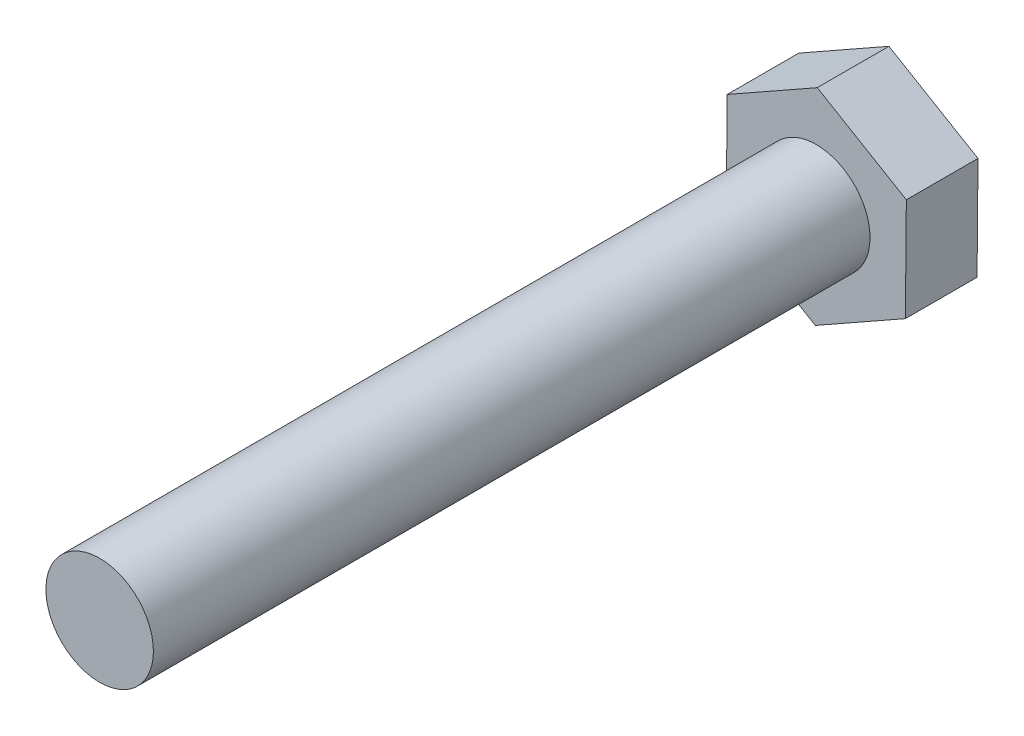
ISO-10303-21;
HEADER;
FILE_DESCRIPTION(('STEP AP214'),'2;1');
FILE_NAME('part.step','',(''),(''),'','','');
FILE_SCHEMA(('AUTOMOTIVE_DESIGN { 1 0 10303 214 1 1 1 1 }'));
ENDSEC;
DATA;
#1=APPLICATION_CONTEXT('core data for automotive mechanical design processes');
#2=APPLICATION_PROTOCOL_DEFINITION('international standard','automotive_design',2000,#1);
#3=PRODUCT_CONTEXT('',#1,'mechanical');
#4=PRODUCT('Part','Part','',(#3));
#5=PRODUCT_RELATED_PRODUCT_CATEGORY('part','',(#4));
#6=PRODUCT_DEFINITION_FORMATION('','',#4);
#7=PRODUCT_DEFINITION_CONTEXT('part definition',#1,'design');
#8=PRODUCT_DEFINITION('design','',#6,#7);
#9=PRODUCT_DEFINITION_SHAPE('','',#8);
#10=(LENGTH_UNIT() NAMED_UNIT(*) SI_UNIT(.MILLI.,.METRE.));
#11=(NAMED_UNIT(*) PLANE_ANGLE_UNIT() SI_UNIT($,.RADIAN.));
#12=(NAMED_UNIT(*) SI_UNIT($,.STERADIAN.) SOLID_ANGLE_UNIT());
#13=UNCERTAINTY_MEASURE_WITH_UNIT(LENGTH_MEASURE(1.E-05),#10,'distance_accuracy_value','');
#14=(GEOMETRIC_REPRESENTATION_CONTEXT(3) GLOBAL_UNCERTAINTY_ASSIGNED_CONTEXT((#13)) GLOBAL_UNIT_ASSIGNED_CONTEXT((#10,
#11,#12)) REPRESENTATION_CONTEXT('',''));
#15=CARTESIAN_POINT('',(0.,0.,0.));
#16=DIRECTION('',(0.,0.,1.));
#17=DIRECTION('',(1.,0.,0.));
#18=AXIS2_PLACEMENT_3D('',#15,#16,#17);
#19=CARTESIAN_POINT('',(-0.0525562027885923,-5.77326347734813,4.));
#20=DIRECTION('',(-0.492095852994147,0.870541022276356,0.));
#21=DIRECTION('',(-0.870541022276356,-0.492095852994147,0.));
#22=AXIS2_PLACEMENT_3D('',#19,#20,#21);
#23=PLANE('',#22);
#24=DIRECTION('',(0.870541022276356,0.492095852994147,0.));
#25=VECTOR('',#24,1.);
#26=CARTESIAN_POINT('',(-0.0525562027885923,-5.77326347734813,0.));
#27=LINE('',#26,#25);
#28=CARTESIAN_POINT('',(-0.0525562027885923,-5.77326347734813,0.));
#29=VERTEX_POINT('',#28);
#30=CARTESIAN_POINT('',(4.97351473273007,-2.93214674541543,0.));
#31=VERTEX_POINT('',#30);
#32=EDGE_CURVE('E117',#29,#31,#27,.T.);
#33=ORIENTED_EDGE('',*,*,#32,.T.);
#34=DIRECTION('',(0.,0.,-1.));
#35=VECTOR('',#34,1.);
#36=CARTESIAN_POINT('',(4.97351473273007,-2.93214674541543,4.));
#37=LINE('',#36,#35);
#38=CARTESIAN_POINT('',(4.97351473273007,-2.93214674541543,4.));
#39=VERTEX_POINT('',#38);
#40=EDGE_CURVE('E11',#39,#31,#37,.T.);
#41=ORIENTED_EDGE('',*,*,#40,.F.);
#42=DIRECTION('',(0.870541022276356,0.492095852994147,0.));
#43=VECTOR('',#42,1.);
#44=CARTESIAN_POINT('',(-0.0525562027885923,-5.77326347734813,4.));
#45=LINE('',#44,#43);
#46=CARTESIAN_POINT('',(-0.0525562027885923,-5.77326347734813,4.));
#47=VERTEX_POINT('',#46);
#48=EDGE_CURVE('E128',#47,#39,#45,.T.);
#49=ORIENTED_EDGE('',*,*,#48,.F.);
#50=DIRECTION('',(0.,0.,-1.));
#51=VECTOR('',#50,1.);
#52=CARTESIAN_POINT('',(-0.0525562027885923,-5.77326347734813,4.));
#53=LINE('',#52,#51);
#54=EDGE_CURVE('E113',#47,#29,#53,.T.);
#55=ORIENTED_EDGE('',*,*,#54,.T.);
#56=EDGE_LOOP('',(#33,#41,#49,#55));
#57=FACE_BOUND('',#56,.T.);
#58=ADVANCED_FACE('F33',(#57),#23,.F.);
#59=CARTESIAN_POINT('',(4.97351473273007,-2.93214674541543,4.));
#60=DIRECTION('',(-0.999958566824873,0.00910300134827328,0.));
#61=DIRECTION('',(-0.00910300134827329,-0.999958566824873,0.));
#62=AXIS2_PLACEMENT_3D('',#59,#60,#61);
#63=PLANE('',#62);
#64=DIRECTION('',(0.00910300134827328,0.999958566824873,0.));
#65=VECTOR('',#64,1.);
#66=CARTESIAN_POINT('',(4.97351473273007,-2.93214674541543,0.));
#67=LINE('',#66,#65);
#68=CARTESIAN_POINT('',(5.02607093551866,2.8411167319327,0.));
#69=VERTEX_POINT('',#68);
#70=EDGE_CURVE('E120',#31,#69,#67,.T.);
#71=ORIENTED_EDGE('',*,*,#70,.T.);
#72=DIRECTION('',(0.,0.,-1.));
#73=VECTOR('',#72,1.);
#74=CARTESIAN_POINT('',(5.02607093551866,2.8411167319327,4.));
#75=LINE('',#74,#73);
#76=CARTESIAN_POINT('',(5.02607093551866,2.8411167319327,4.));
#77=VERTEX_POINT('',#76);
#78=EDGE_CURVE('E41',#77,#69,#75,.T.);
#79=ORIENTED_EDGE('',*,*,#78,.F.);
#80=DIRECTION('',(0.00910300134827328,0.999958566824873,0.));
#81=VECTOR('',#80,1.);
#82=CARTESIAN_POINT('',(4.97351473273007,-2.93214674541543,4.));
#83=LINE('',#82,#81);
#84=EDGE_CURVE('E86',#39,#77,#83,.T.);
#85=ORIENTED_EDGE('',*,*,#84,.F.);
#86=ORIENTED_EDGE('',*,*,#40,.T.);
#87=EDGE_LOOP('',(#71,#79,#85,#86));
#88=FACE_BOUND('',#87,.T.);
#89=ADVANCED_FACE('F153',(#88),#63,.F.);
#90=CARTESIAN_POINT('',(5.02607093551866,2.8411167319327,4.));
#91=DIRECTION('',(-0.507862713830725,-0.861438020928082,0.));
#92=DIRECTION('',(0.861438020928082,-0.507862713830725,0.));
#93=AXIS2_PLACEMENT_3D('',#90,#91,#92);
#94=PLANE('',#93);
#95=DIRECTION('',(-0.861438020928082,0.507862713830725,0.));
#96=VECTOR('',#95,1.);
#97=CARTESIAN_POINT('',(5.02607093551866,2.8411167319327,0.));
#98=LINE('',#97,#96);
#99=CARTESIAN_POINT('',(0.0525562027885952,5.77326347734813,0.));
#100=VERTEX_POINT('',#99);
#101=EDGE_CURVE('E123',#69,#100,#98,.T.);
#102=ORIENTED_EDGE('',*,*,#101,.T.);
#103=DIRECTION('',(0.,0.,-1.));
#104=VECTOR('',#103,1.);
#105=CARTESIAN_POINT('',(0.0525562027885952,5.77326347734813,4.));
#106=LINE('',#105,#104);
#107=CARTESIAN_POINT('',(0.0525562027885952,5.77326347734813,4.));
#108=VERTEX_POINT('',#107);
#109=EDGE_CURVE('E108',#108,#100,#106,.T.);
#110=ORIENTED_EDGE('',*,*,#109,.F.);
#111=DIRECTION('',(-0.861438020928082,0.507862713830725,0.));
#112=VECTOR('',#111,1.);
#113=CARTESIAN_POINT('',(5.02607093551866,2.8411167319327,4.));
#114=LINE('',#113,#112);
#115=EDGE_CURVE('E99',#77,#108,#114,.T.);
#116=ORIENTED_EDGE('',*,*,#115,.F.);
#117=ORIENTED_EDGE('',*,*,#78,.T.);
#118=EDGE_LOOP('',(#102,#110,#116,#117));
#119=FACE_BOUND('',#118,.T.);
#120=ADVANCED_FACE('F134',(#119),#94,.F.);
#121=CARTESIAN_POINT('',(0.0525562027885952,5.77326347734813,4.));
#122=DIRECTION('',(0.492095852994147,-0.870541022276356,0.));
#123=DIRECTION('',(0.870541022276356,0.492095852994147,0.));
#124=AXIS2_PLACEMENT_3D('',#121,#122,#123);
#125=PLANE('',#124);
#126=DIRECTION('',(-0.870541022276356,-0.492095852994147,0.));
#127=VECTOR('',#126,1.);
#128=CARTESIAN_POINT('',(0.0525562027885952,5.77326347734813,0.));
#129=LINE('',#128,#127);
#130=CARTESIAN_POINT('',(-4.97351473273007,2.93214674541543,0.));
#131=VERTEX_POINT('',#130);
#132=EDGE_CURVE('E107',#100,#131,#129,.T.);
#133=ORIENTED_EDGE('',*,*,#132,.T.);
#134=DIRECTION('',(0.,0.,-1.));
#135=VECTOR('',#134,1.);
#136=CARTESIAN_POINT('',(-4.97351473273007,2.93214674541543,4.));
#137=LINE('',#136,#135);
#138=CARTESIAN_POINT('',(-4.97351473273007,2.93214674541543,4.));
#139=VERTEX_POINT('',#138);
#140=EDGE_CURVE('E104',#139,#131,#137,.T.);
#141=ORIENTED_EDGE('',*,*,#140,.F.);
#142=DIRECTION('',(-0.870541022276356,-0.492095852994147,0.));
#143=VECTOR('',#142,1.);
#144=CARTESIAN_POINT('',(0.0525562027885952,5.77326347734813,4.));
#145=LINE('',#144,#143);
#146=EDGE_CURVE('E93',#108,#139,#145,.T.);
#147=ORIENTED_EDGE('',*,*,#146,.F.);
#148=ORIENTED_EDGE('',*,*,#109,.T.);
#149=EDGE_LOOP('',(#133,#141,#147,#148));
#150=FACE_BOUND('',#149,.T.);
#151=ADVANCED_FACE('F105',(#150),#125,.F.);
#152=CARTESIAN_POINT('',(-4.97351473273007,2.93214674541543,4.));
#153=DIRECTION('',(0.999958566824873,-0.00910300134827374,0.));
#154=DIRECTION('',(0.00910300134827374,0.999958566824873,0.));
#155=AXIS2_PLACEMENT_3D('',#152,#153,#154);
#156=PLANE('',#155);
#157=DIRECTION('',(-0.00910300134827374,-0.999958566824873,0.));
#158=VECTOR('',#157,1.);
#159=CARTESIAN_POINT('',(-4.97351473273007,2.93214674541543,0.));
#160=LINE('',#159,#158);
#161=CARTESIAN_POINT('',(-5.02607093551866,-2.84111673193269,0.));
#162=VERTEX_POINT('',#161);
#163=EDGE_CURVE('E72',#131,#162,#160,.T.);
#164=ORIENTED_EDGE('',*,*,#163,.T.);
#165=DIRECTION('',(0.,0.,-1.));
#166=VECTOR('',#165,1.);
#167=CARTESIAN_POINT('',(-5.02607093551866,-2.84111673193269,4.));
#168=LINE('',#167,#166);
#169=CARTESIAN_POINT('',(-5.02607093551866,-2.84111673193269,4.));
#170=VERTEX_POINT('',#169);
#171=EDGE_CURVE('E109',#170,#162,#168,.T.);
#172=ORIENTED_EDGE('',*,*,#171,.F.);
#173=DIRECTION('',(-0.00910300134827374,-0.999958566824873,0.));
#174=VECTOR('',#173,1.);
#175=CARTESIAN_POINT('',(-4.97351473273007,2.93214674541543,4.));
#176=LINE('',#175,#174);
#177=EDGE_CURVE('E97',#139,#170,#176,.T.);
#178=ORIENTED_EDGE('',*,*,#177,.F.);
#179=ORIENTED_EDGE('',*,*,#140,.T.);
#180=EDGE_LOOP('',(#164,#172,#178,#179));
#181=FACE_BOUND('',#180,.T.);
#182=ADVANCED_FACE('F111',(#181),#156,.F.);
#183=CARTESIAN_POINT('',(-5.02607093551866,-2.84111673193269,4.));
#184=DIRECTION('',(0.507862713830725,0.861438020928082,0.));
#185=DIRECTION('',(-0.861438020928082,0.507862713830725,0.));
#186=AXIS2_PLACEMENT_3D('',#183,#184,#185);
#187=PLANE('',#186);
#188=DIRECTION('',(0.861438020928082,-0.507862713830725,0.));
#189=VECTOR('',#188,1.);
#190=CARTESIAN_POINT('',(-5.02607093551866,-2.84111673193269,0.));
#191=LINE('',#190,#189);
#192=EDGE_CURVE('E78',#162,#29,#191,.T.);
#193=ORIENTED_EDGE('',*,*,#192,.T.);
#194=ORIENTED_EDGE('',*,*,#54,.F.);
#195=DIRECTION('',(0.861438020928082,-0.507862713830725,0.));
#196=VECTOR('',#195,1.);
#197=CARTESIAN_POINT('',(-5.02607093551866,-2.84111673193269,4.));
#198=LINE('',#197,#196);
#199=EDGE_CURVE('E49',#170,#47,#198,.T.);
#200=ORIENTED_EDGE('',*,*,#199,.F.);
#201=ORIENTED_EDGE('',*,*,#171,.T.);
#202=EDGE_LOOP('',(#193,#194,#200,#201));
#203=FACE_BOUND('',#202,.T.);
#204=ADVANCED_FACE('F141',(#203),#187,.F.);
#205=CARTESIAN_POINT('',(0.,0.,4.));
#206=DIRECTION('',(0.,0.,1.));
#207=DIRECTION('',(1.,0.,0.));
#208=AXIS2_PLACEMENT_3D('',#205,#206,#207);
#209=PLANE('',#208);
#210=CARTESIAN_POINT('',(0.,0.,4.));
#211=DIRECTION('',(0.,0.,1.));
#212=DIRECTION('',(1.,0.,0.));
#213=AXIS2_PLACEMENT_3D('',#210,#211,#212);
#214=CIRCLE('',#213,3.);
#215=CARTESIAN_POINT('',(3.,0.,4.));
#216=VERTEX_POINT('',#215);
#217=EDGE_CURVE('E214',#216,#216,#214,.T.);
#218=ORIENTED_EDGE('',*,*,#217,.F.);
#219=EDGE_LOOP('',(#218));
#220=FACE_BOUND('',#219,.T.);
#221=ORIENTED_EDGE('',*,*,#48,.T.);
#222=ORIENTED_EDGE('',*,*,#84,.T.);
#223=ORIENTED_EDGE('',*,*,#115,.T.);
#224=ORIENTED_EDGE('',*,*,#146,.T.);
#225=ORIENTED_EDGE('',*,*,#177,.T.);
#226=ORIENTED_EDGE('',*,*,#199,.T.);
#227=EDGE_LOOP('',(#221,#222,#223,#224,#225,#226));
#228=FACE_BOUND('',#227,.T.);
#229=ADVANCED_FACE('F95',(#220,#228),#209,.T.);
#230=CARTESIAN_POINT('',(0.,0.,0.));
#231=DIRECTION('',(0.,0.,1.));
#232=DIRECTION('',(1.,0.,0.));
#233=AXIS2_PLACEMENT_3D('',#230,#231,#232);
#234=PLANE('',#233);
#235=ORIENTED_EDGE('',*,*,#32,.F.);
#236=ORIENTED_EDGE('',*,*,#192,.F.);
#237=ORIENTED_EDGE('',*,*,#163,.F.);
#238=ORIENTED_EDGE('',*,*,#132,.F.);
#239=ORIENTED_EDGE('',*,*,#101,.F.);
#240=ORIENTED_EDGE('',*,*,#70,.F.);
#241=EDGE_LOOP('',(#235,#236,#237,#238,#239,#240));
#242=FACE_BOUND('',#241,.T.);
#243=ADVANCED_FACE('F137',(#242),#234,.F.);
#244=CARTESIAN_POINT('',(0.,0.,44.));
#245=DIRECTION('',(0.,0.,-1.));
#246=DIRECTION('',(-1.,0.,0.));
#247=AXIS2_PLACEMENT_3D('',#244,#245,#246);
#248=CYLINDRICAL_SURFACE('',#247,3.);
#249=CARTESIAN_POINT('',(0.,0.,44.));
#250=DIRECTION('',(0.,0.,1.));
#251=DIRECTION('',(1.,0.,0.));
#252=AXIS2_PLACEMENT_3D('',#249,#250,#251);
#253=CIRCLE('',#252,3.);
#254=CARTESIAN_POINT('',(3.,0.,44.));
#255=VERTEX_POINT('',#254);
#256=EDGE_CURVE('E121',#255,#255,#253,.T.);
#257=ORIENTED_EDGE('',*,*,#256,.F.);
#258=EDGE_LOOP('',(#257));
#259=FACE_BOUND('',#258,.T.);
#260=ORIENTED_EDGE('',*,*,#217,.T.);
#261=EDGE_LOOP('',(#260));
#262=FACE_BOUND('',#261,.T.);
#263=ADVANCED_FACE('F185',(#259,#262),#248,.T.);
#264=CARTESIAN_POINT('',(0.,0.,44.));
#265=DIRECTION('',(0.,0.,1.));
#266=DIRECTION('',(1.,0.,0.));
#267=AXIS2_PLACEMENT_3D('',#264,#265,#266);
#268=PLANE('',#267);
#269=ORIENTED_EDGE('',*,*,#256,.T.);
#270=EDGE_LOOP('',(#269));
#271=FACE_BOUND('',#270,.T.);
#272=ADVANCED_FACE('F198',(#271),#268,.T.);
#273=CLOSED_SHELL('',(#58,#89,#120,#151,#182,#204,#229,#243,#263,#272));
#274=MANIFOLD_SOLID_BREP('B2',#273);
#275=ADVANCED_BREP_SHAPE_REPRESENTATION('',(#18,#274),#14);
#276=SHAPE_DEFINITION_REPRESENTATION(#9,#275);
ENDSEC;
END-ISO-10303-21;
